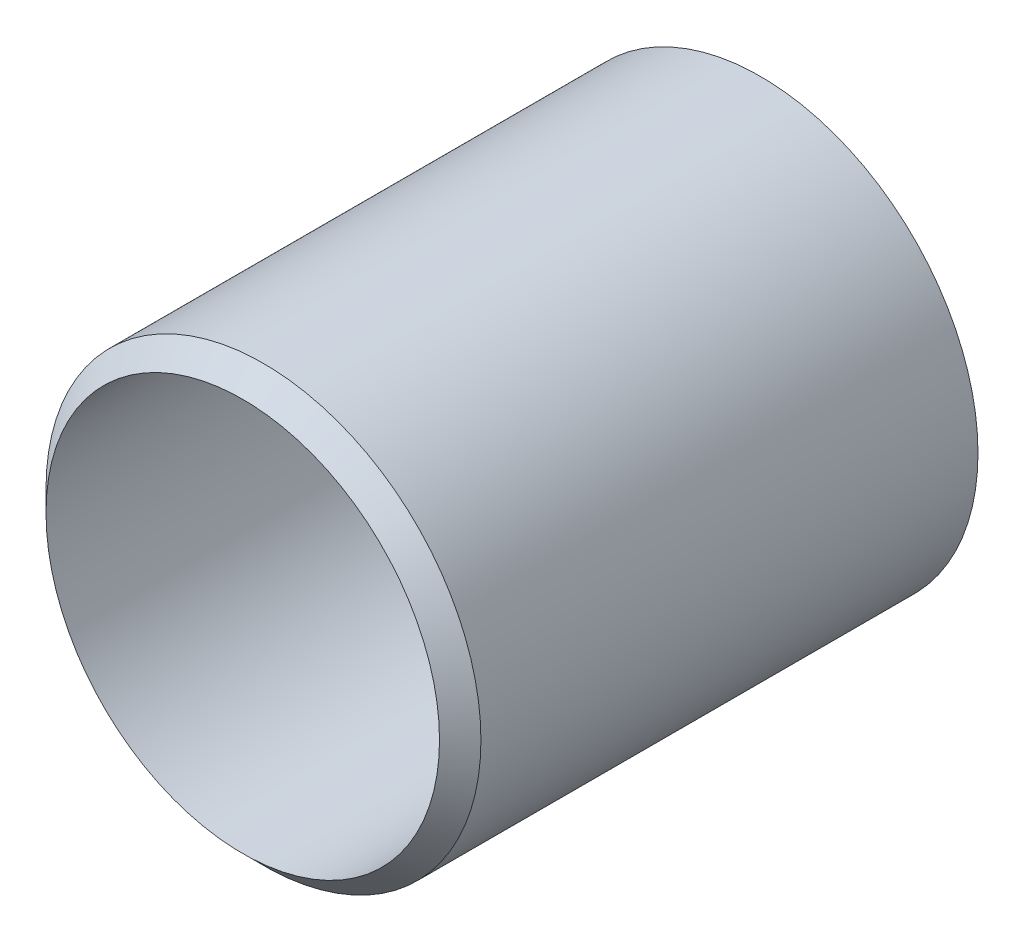
ISO-10303-21;
HEADER;
FILE_DESCRIPTION(('STEP AP214'),'2;1');
FILE_NAME('part.step','',(''),(''),'','','');
FILE_SCHEMA(('AUTOMOTIVE_DESIGN { 1 0 10303 214 1 1 1 1 }'));
ENDSEC;
DATA;
#1=APPLICATION_CONTEXT('core data for automotive mechanical design processes');
#2=APPLICATION_PROTOCOL_DEFINITION('international standard','automotive_design',2000,#1);
#3=PRODUCT_CONTEXT('',#1,'mechanical');
#4=PRODUCT('Part','Part','',(#3));
#5=PRODUCT_RELATED_PRODUCT_CATEGORY('part','',(#4));
#6=PRODUCT_DEFINITION_FORMATION('','',#4);
#7=PRODUCT_DEFINITION_CONTEXT('part definition',#1,'design');
#8=PRODUCT_DEFINITION('design','',#6,#7);
#9=PRODUCT_DEFINITION_SHAPE('','',#8);
#10=(LENGTH_UNIT() NAMED_UNIT(*) SI_UNIT(.MILLI.,.METRE.));
#11=(NAMED_UNIT(*) PLANE_ANGLE_UNIT() SI_UNIT($,.RADIAN.));
#12=(NAMED_UNIT(*) SI_UNIT($,.STERADIAN.) SOLID_ANGLE_UNIT());
#13=UNCERTAINTY_MEASURE_WITH_UNIT(LENGTH_MEASURE(1.E-05),#10,'distance_accuracy_value','');
#14=(GEOMETRIC_REPRESENTATION_CONTEXT(3) GLOBAL_UNCERTAINTY_ASSIGNED_CONTEXT((#13)) GLOBAL_UNIT_ASSIGNED_CONTEXT((#10,
#11,#12)) REPRESENTATION_CONTEXT('',''));
#15=CARTESIAN_POINT('',(0.,0.,0.));
#16=DIRECTION('',(0.,0.,1.));
#17=DIRECTION('',(1.,0.,0.));
#18=AXIS2_PLACEMENT_3D('',#15,#16,#17);
#19=CARTESIAN_POINT('',(0.,0.,0.));
#20=DIRECTION('',(0.,0.,1.));
#21=DIRECTION('',(1.,0.,0.));
#22=AXIS2_PLACEMENT_3D('',#19,#20,#21);
#23=PLANE('',#22);
#24=CARTESIAN_POINT('',(0.,0.,0.));
#25=DIRECTION('',(0.,0.,1.));
#26=DIRECTION('',(1.,0.,0.));
#27=AXIS2_PLACEMENT_3D('',#24,#25,#26);
#28=CIRCLE('',#27,31.5);
#29=CARTESIAN_POINT('',(31.5,0.,0.));
#30=VERTEX_POINT('',#29);
#31=EDGE_CURVE('E42',#30,#30,#28,.T.);
#32=ORIENTED_EDGE('',*,*,#31,.F.);
#33=EDGE_LOOP('',(#32));
#34=FACE_BOUND('',#33,.T.);
#35=CARTESIAN_POINT('',(0.,0.,0.));
#36=DIRECTION('',(0.,0.,1.));
#37=DIRECTION('',(1.,0.,0.));
#38=AXIS2_PLACEMENT_3D('',#35,#36,#37);
#39=CIRCLE('',#38,28.5);
#40=CARTESIAN_POINT('',(28.5,0.,0.));
#41=VERTEX_POINT('',#40);
#42=EDGE_CURVE('E46',#41,#41,#39,.T.);
#43=ORIENTED_EDGE('',*,*,#42,.T.);
#44=EDGE_LOOP('',(#43));
#45=FACE_BOUND('',#44,.T.);
#46=ADVANCED_FACE('F31',(#34,#45),#23,.F.);
#47=CARTESIAN_POINT('',(0.,0.,76.));
#48=DIRECTION('',(0.,0.,-1.));
#49=DIRECTION('',(-1.,0.,0.));
#50=AXIS2_PLACEMENT_3D('',#47,#48,#49);
#51=CYLINDRICAL_SURFACE('',#50,31.5);
#52=CARTESIAN_POINT('',(0.,0.,72.));
#53=DIRECTION('',(0.,0.,1.));
#54=DIRECTION('',(1.,0.,0.));
#55=AXIS2_PLACEMENT_3D('',#52,#53,#54);
#56=CIRCLE('',#55,31.5);
#57=CARTESIAN_POINT('',(31.5,0.,72.));
#58=VERTEX_POINT('',#57);
#59=EDGE_CURVE('E10',#58,#58,#56,.F.);
#60=ORIENTED_EDGE('',*,*,#59,.T.);
#61=EDGE_LOOP('',(#60));
#62=FACE_BOUND('',#61,.T.);
#63=ORIENTED_EDGE('',*,*,#31,.T.);
#64=EDGE_LOOP('',(#63));
#65=FACE_BOUND('',#64,.T.);
#66=ADVANCED_FACE('F55',(#62,#65),#51,.T.);
#67=CARTESIAN_POINT('',(0.,0.,76.));
#68=DIRECTION('',(0.,0.,-1.));
#69=DIRECTION('',(-1.,0.,0.));
#70=AXIS2_PLACEMENT_3D('',#67,#68,#69);
#71=CYLINDRICAL_SURFACE('',#70,28.5);
#72=CARTESIAN_POINT('',(0.,0.,74.9999999999999));
#73=DIRECTION('',(0.,0.,-1.));
#74=DIRECTION('',(-1.,0.,0.));
#75=AXIS2_PLACEMENT_3D('',#72,#73,#74);
#76=CIRCLE('',#75,28.5);
#77=CARTESIAN_POINT('',(-28.5,0.,74.9999999999999));
#78=VERTEX_POINT('',#77);
#79=EDGE_CURVE('E38',#78,#78,#76,.F.);
#80=ORIENTED_EDGE('',*,*,#79,.T.);
#81=EDGE_LOOP('',(#80));
#82=FACE_BOUND('',#81,.T.);
#83=ORIENTED_EDGE('',*,*,#42,.F.);
#84=EDGE_LOOP('',(#83));
#85=FACE_BOUND('',#84,.T.);
#86=ADVANCED_FACE('F53',(#82,#85),#71,.F.);
#87=CARTESIAN_POINT('',(0.,0.,76.));
#88=DIRECTION('',(0.,0.,-1.));
#89=DIRECTION('',(-1.,0.,0.));
#90=AXIS2_PLACEMENT_3D('',#87,#88,#89);
#91=CONICAL_SURFACE('',#90,27.4999999999999,0.785398163397453);
#92=ORIENTED_EDGE('',*,*,#59,.F.);
#93=EDGE_LOOP('',(#92));
#94=FACE_BOUND('',#93,.T.);
#95=ORIENTED_EDGE('',*,*,#79,.F.);
#96=EDGE_LOOP('',(#95));
#97=FACE_BOUND('',#96,.T.);
#98=ADVANCED_FACE('F33',(#94,#97),#91,.T.);
#99=CLOSED_SHELL('',(#46,#66,#86,#98));
#100=MANIFOLD_SOLID_BREP('B2',#99);
#101=ADVANCED_BREP_SHAPE_REPRESENTATION('',(#18,#100),#14);
#102=SHAPE_DEFINITION_REPRESENTATION(#9,#101);
ENDSEC;
END-ISO-10303-21;
